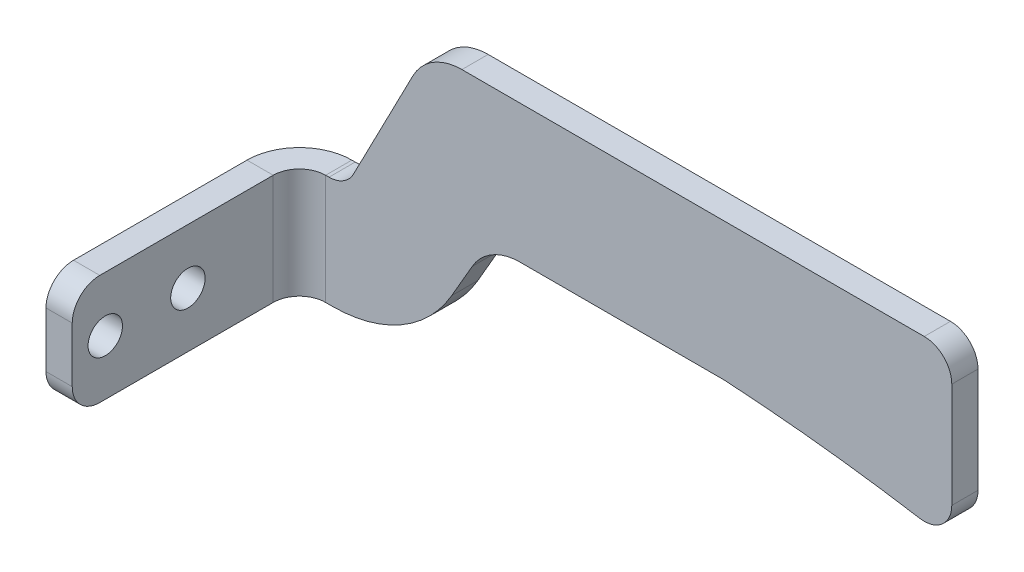
ISO-10303-21;
HEADER;
FILE_DESCRIPTION(('STEP AP214'),'2;1');
FILE_NAME('part.step','',(''),(''),'','','');
FILE_SCHEMA(('AUTOMOTIVE_DESIGN { 1 0 10303 214 1 1 1 1 }'));
ENDSEC;
DATA;
#1=APPLICATION_CONTEXT('core data for automotive mechanical design processes');
#2=APPLICATION_PROTOCOL_DEFINITION('international standard','automotive_design',2000,#1);
#3=PRODUCT_CONTEXT('',#1,'mechanical');
#4=PRODUCT('Part','Part','',(#3));
#5=PRODUCT_RELATED_PRODUCT_CATEGORY('part','',(#4));
#6=PRODUCT_DEFINITION_FORMATION('','',#4);
#7=PRODUCT_DEFINITION_CONTEXT('part definition',#1,'design');
#8=PRODUCT_DEFINITION('design','',#6,#7);
#9=PRODUCT_DEFINITION_SHAPE('','',#8);
#10=(LENGTH_UNIT() NAMED_UNIT(*) SI_UNIT(.MILLI.,.METRE.));
#11=(NAMED_UNIT(*) PLANE_ANGLE_UNIT() SI_UNIT($,.RADIAN.));
#12=(NAMED_UNIT(*) SI_UNIT($,.STERADIAN.) SOLID_ANGLE_UNIT());
#13=UNCERTAINTY_MEASURE_WITH_UNIT(LENGTH_MEASURE(1.E-05),#10,'distance_accuracy_value','');
#14=(GEOMETRIC_REPRESENTATION_CONTEXT(3) GLOBAL_UNCERTAINTY_ASSIGNED_CONTEXT((#13)) GLOBAL_UNIT_ASSIGNED_CONTEXT((#10,
#11,#12)) REPRESENTATION_CONTEXT('',''));
#15=CARTESIAN_POINT('',(0.,0.,0.));
#16=DIRECTION('',(0.,0.,1.));
#17=DIRECTION('',(1.,0.,0.));
#18=AXIS2_PLACEMENT_3D('',#15,#16,#17);
#19=CARTESIAN_POINT('',(1.21624327025932,25.,6.35));
#20=DIRECTION('',(0.,0.,1.));
#21=DIRECTION('',(1.,0.,0.));
#22=AXIS2_PLACEMENT_3D('',#19,#20,#21);
#23=CYLINDRICAL_SURFACE('',#22,25.);
#24=DIRECTION('',(0.,0.,1.));
#25=VECTOR('',#24,1.);
#26=CARTESIAN_POINT('',(1.21624327025932,0.,6.35));
#27=LINE('',#26,#25);
#28=CARTESIAN_POINT('',(1.21624327025927,0.,1.59));
#29=VERTEX_POINT('',#28);
#30=CARTESIAN_POINT('',(1.21624327025932,0.,6.35));
#31=VERTEX_POINT('',#30);
#32=EDGE_CURVE('E378',#29,#31,#27,.T.);
#33=ORIENTED_EDGE('',*,*,#32,.F.);
#34=CARTESIAN_POINT('',(1.21624327025932,25.,1.59));
#35=DIRECTION('',(0.,0.,1.));
#36=DIRECTION('',(1.,0.,0.));
#37=AXIS2_PLACEMENT_3D('',#34,#35,#36);
#38=CIRCLE('',#37,25.);
#39=CARTESIAN_POINT('',(22.8668783648703,12.5,1.59));
#40=VERTEX_POINT('',#39);
#41=EDGE_CURVE('E347',#29,#40,#38,.T.);
#42=ORIENTED_EDGE('',*,*,#41,.T.);
#43=DIRECTION('',(0.,0.,1.));
#44=VECTOR('',#43,1.);
#45=CARTESIAN_POINT('',(22.8668783648703,12.5000000000001,6.35));
#46=LINE('',#45,#44);
#47=CARTESIAN_POINT('',(22.8668783648703,12.5000000000001,6.35));
#48=VERTEX_POINT('',#47);
#49=EDGE_CURVE('E376',#40,#48,#46,.T.);
#50=ORIENTED_EDGE('',*,*,#49,.T.);
#51=CARTESIAN_POINT('',(1.21624327025932,25.,6.35));
#52=DIRECTION('',(0.,0.,1.));
#53=DIRECTION('',(1.,0.,0.));
#54=AXIS2_PLACEMENT_3D('',#51,#52,#53);
#55=CIRCLE('',#54,25.);
#56=EDGE_CURVE('E270',#31,#48,#55,.T.);
#57=ORIENTED_EDGE('',*,*,#56,.F.);
#58=EDGE_LOOP('',(#33,#42,#50,#57));
#59=FACE_BOUND('',#58,.T.);
#60=ADVANCED_FACE('F74',(#59),#23,.T.);
#61=CARTESIAN_POINT('',(22.8668783648703,12.5000000000001,6.35));
#62=DIRECTION('',(0.86602540378444,-0.499999999999998,0.));
#63=DIRECTION('',(0.499999999999998,0.86602540378444,0.));
#64=AXIS2_PLACEMENT_3D('',#61,#62,#63);
#65=PLANE('',#64);
#66=ORIENTED_EDGE('',*,*,#49,.F.);
#67=DIRECTION('',(0.499999999999998,0.86602540378444,0.));
#68=VECTOR('',#67,1.);
#69=CARTESIAN_POINT('',(22.8668783648703,12.5000000000001,1.59));
#70=LINE('',#69,#68);
#71=CARTESIAN_POINT('',(26.6085481156726,18.9807621135333,1.59));
#72=VERTEX_POINT('',#71);
#73=EDGE_CURVE('E344',#40,#72,#70,.T.);
#74=ORIENTED_EDGE('',*,*,#73,.T.);
#75=DIRECTION('',(0.,0.,1.));
#76=VECTOR('',#75,1.);
#77=CARTESIAN_POINT('',(26.6085481156726,18.9807621135333,6.35));
#78=LINE('',#77,#76);
#79=CARTESIAN_POINT('',(26.6085481156726,18.9807621135333,6.35));
#80=VERTEX_POINT('',#79);
#81=EDGE_CURVE('E374',#72,#80,#78,.T.);
#82=ORIENTED_EDGE('',*,*,#81,.T.);
#83=DIRECTION('',(0.499999999999998,0.86602540378444,0.));
#84=VECTOR('',#83,1.);
#85=CARTESIAN_POINT('',(22.8668783648703,12.5000000000001,6.35));
#86=LINE('',#85,#84);
#87=EDGE_CURVE('E273',#48,#80,#86,.T.);
#88=ORIENTED_EDGE('',*,*,#87,.F.);
#89=EDGE_LOOP('',(#66,#74,#82,#88));
#90=FACE_BOUND('',#89,.T.);
#91=ADVANCED_FACE('F447',(#90),#65,.T.);
#92=CARTESIAN_POINT('',(35.2688021535169,13.9807621135333,6.35));
#93=DIRECTION('',(0.,0.,1.));
#94=DIRECTION('',(1.,0.,0.));
#95=AXIS2_PLACEMENT_3D('',#92,#93,#94);
#96=CYLINDRICAL_SURFACE('',#95,10.);
#97=ORIENTED_EDGE('',*,*,#81,.F.);
#98=CARTESIAN_POINT('',(35.268802153517,13.9807621135333,1.59));
#99=DIRECTION('',(0.,0.,-1.));
#100=DIRECTION('',(-1.,0.,0.));
#101=AXIS2_PLACEMENT_3D('',#98,#99,#100);
#102=CIRCLE('',#101,10.);
#103=CARTESIAN_POINT('',(35.268802153517,23.9807621135333,1.59));
#104=VERTEX_POINT('',#103);
#105=EDGE_CURVE('E341',#72,#104,#102,.T.);
#106=ORIENTED_EDGE('',*,*,#105,.T.);
#107=DIRECTION('',(0.,0.,1.));
#108=VECTOR('',#107,1.);
#109=CARTESIAN_POINT('',(35.268802153517,23.9807621135333,6.35));
#110=LINE('',#109,#108);
#111=CARTESIAN_POINT('',(35.268802153517,23.9807621135333,6.35));
#112=VERTEX_POINT('',#111);
#113=EDGE_CURVE('E372',#104,#112,#110,.T.);
#114=ORIENTED_EDGE('',*,*,#113,.T.);
#115=CARTESIAN_POINT('',(35.2688021535169,13.9807621135333,6.35));
#116=DIRECTION('',(0.,0.,-1.));
#117=DIRECTION('',(1.,0.,0.));
#118=AXIS2_PLACEMENT_3D('',#115,#116,#117);
#119=CIRCLE('',#118,10.);
#120=EDGE_CURVE('E276',#80,#112,#119,.T.);
#121=ORIENTED_EDGE('',*,*,#120,.F.);
#122=EDGE_LOOP('',(#97,#106,#114,#121));
#123=FACE_BOUND('',#122,.T.);
#124=ADVANCED_FACE('F453',(#123),#96,.F.);
#125=CARTESIAN_POINT('',(35.268802153517,23.9807621135333,6.35));
#126=DIRECTION('',(0.,-1.,0.));
#127=DIRECTION('',(1.,0.,0.));
#128=AXIS2_PLACEMENT_3D('',#125,#126,#127);
#129=PLANE('',#128);
#130=ORIENTED_EDGE('',*,*,#113,.F.);
#131=DIRECTION('',(1.,0.,0.));
#132=VECTOR('',#131,1.);
#133=CARTESIAN_POINT('',(0.60788379679623,23.9807621135333,1.59));
#134=LINE('',#133,#132);
#135=CARTESIAN_POINT('',(72.4353250304522,23.9807621135333,1.59));
#136=VERTEX_POINT('',#135);
#137=EDGE_CURVE('E338',#104,#136,#134,.T.);
#138=ORIENTED_EDGE('',*,*,#137,.T.);
#139=DIRECTION('',(0.,0.,1.));
#140=VECTOR('',#139,1.);
#141=CARTESIAN_POINT('',(72.4353250304512,23.9807621135333,6.35));
#142=LINE('',#141,#140);
#143=CARTESIAN_POINT('',(72.4353250304512,23.9807621135333,6.35));
#144=VERTEX_POINT('',#143);
#145=EDGE_CURVE('E370',#136,#144,#142,.T.);
#146=ORIENTED_EDGE('',*,*,#145,.T.);
#147=DIRECTION('',(1.,0.,0.));
#148=VECTOR('',#147,1.);
#149=CARTESIAN_POINT('',(35.268802153517,23.9807621135333,6.35));
#150=LINE('',#149,#148);
#151=EDGE_CURVE('E279',#112,#144,#150,.T.);
#152=ORIENTED_EDGE('',*,*,#151,.F.);
#153=EDGE_LOOP('',(#130,#138,#146,#152));
#154=FACE_BOUND('',#153,.T.);
#155=ADVANCED_FACE('F527',(#154),#129,.T.);
#156=CARTESIAN_POINT('',(50.9653122460359,-325.360100871369,6.35));
#157=DIRECTION('',(0.,0.,1.));
#158=DIRECTION('',(1.,0.,0.));
#159=AXIS2_PLACEMENT_3D('',#156,#157,#158);
#160=CYLINDRICAL_SURFACE('',#159,350.);
#161=ORIENTED_EDGE('',*,*,#145,.F.);
#162=CARTESIAN_POINT('',(50.9653122460359,-325.36010087137,1.59));
#163=DIRECTION('',(0.,0.,-1.));
#164=DIRECTION('',(-1.,0.,0.));
#165=AXIS2_PLACEMENT_3D('',#162,#163,#164);
#166=CIRCLE('',#165,350.);
#167=CARTESIAN_POINT('',(107.837539609099,19.9883459975337,1.59));
#168=VERTEX_POINT('',#167);
#169=EDGE_CURVE('E335',#136,#168,#166,.T.);
#170=ORIENTED_EDGE('',*,*,#169,.T.);
#171=DIRECTION('',(0.,0.,1.));
#172=VECTOR('',#171,1.);
#173=CARTESIAN_POINT('',(107.837539609099,19.9883459975337,6.35));
#174=LINE('',#173,#172);
#175=CARTESIAN_POINT('',(107.837539609099,19.9883459975337,6.35));
#176=VERTEX_POINT('',#175);
#177=EDGE_CURVE('E368',#168,#176,#174,.T.);
#178=ORIENTED_EDGE('',*,*,#177,.T.);
#179=CARTESIAN_POINT('',(50.9653122460359,-325.360100871369,6.35));
#180=DIRECTION('',(0.,0.,-1.));
#181=DIRECTION('',(1.,0.,0.));
#182=AXIS2_PLACEMENT_3D('',#179,#180,#181);
#183=CIRCLE('',#182,350.);
#184=EDGE_CURVE('E282',#144,#176,#183,.T.);
#185=ORIENTED_EDGE('',*,*,#184,.F.);
#186=EDGE_LOOP('',(#161,#170,#178,#185));
#187=FACE_BOUND('',#186,.T.);
#188=ADVANCED_FACE('F523',(#187),#160,.F.);
#189=CARTESIAN_POINT('',(108.65,24.9218952385181,6.35));
#190=DIRECTION('',(0.,0.,1.));
#191=DIRECTION('',(1.,0.,0.));
#192=AXIS2_PLACEMENT_3D('',#189,#190,#191);
#193=CYLINDRICAL_SURFACE('',#192,5.);
#194=ORIENTED_EDGE('',*,*,#177,.F.);
#195=CARTESIAN_POINT('',(108.65,24.9218952385181,1.59000000000001));
#196=DIRECTION('',(0.,0.,1.));
#197=DIRECTION('',(1.,0.,0.));
#198=AXIS2_PLACEMENT_3D('',#195,#196,#197);
#199=CIRCLE('',#198,5.);
#200=CARTESIAN_POINT('',(113.65,24.9218952385181,1.59000000000001));
#201=VERTEX_POINT('',#200);
#202=EDGE_CURVE('E332',#168,#201,#199,.T.);
#203=ORIENTED_EDGE('',*,*,#202,.T.);
#204=DIRECTION('',(0.,0.,1.));
#205=VECTOR('',#204,1.);
#206=CARTESIAN_POINT('',(113.65,24.9218952385181,6.35));
#207=LINE('',#206,#205);
#208=CARTESIAN_POINT('',(113.65,24.9218952385181,6.35));
#209=VERTEX_POINT('',#208);
#210=EDGE_CURVE('E366',#201,#209,#207,.T.);
#211=ORIENTED_EDGE('',*,*,#210,.T.);
#212=CARTESIAN_POINT('',(108.65,24.9218952385181,6.35));
#213=DIRECTION('',(0.,0.,1.));
#214=DIRECTION('',(1.,0.,0.));
#215=AXIS2_PLACEMENT_3D('',#212,#213,#214);
#216=CIRCLE('',#215,5.);
#217=EDGE_CURVE('E285',#176,#209,#216,.T.);
#218=ORIENTED_EDGE('',*,*,#217,.F.);
#219=EDGE_LOOP('',(#194,#203,#211,#218));
#220=FACE_BOUND('',#219,.T.);
#221=ADVANCED_FACE('F519',(#220),#193,.T.);
#222=CARTESIAN_POINT('',(113.65,24.9218952385181,6.35));
#223=DIRECTION('',(1.,0.,0.));
#224=DIRECTION('',(0.,1.,0.));
#225=AXIS2_PLACEMENT_3D('',#222,#223,#224);
#226=PLANE('',#225);
#227=ORIENTED_EDGE('',*,*,#210,.F.);
#228=DIRECTION('',(0.,1.,0.));
#229=VECTOR('',#228,1.);
#230=CARTESIAN_POINT('',(113.65,25.,1.59000000000001));
#231=LINE('',#230,#229);
#232=CARTESIAN_POINT('',(113.65,43.9807621135333,1.59));
#233=VERTEX_POINT('',#232);
#234=EDGE_CURVE('E329',#201,#233,#231,.T.);
#235=ORIENTED_EDGE('',*,*,#234,.T.);
#236=DIRECTION('',(0.,0.,1.));
#237=VECTOR('',#236,1.);
#238=CARTESIAN_POINT('',(113.65,43.9807621135333,6.35));
#239=LINE('',#238,#237);
#240=CARTESIAN_POINT('',(113.65,43.9807621135333,6.35));
#241=VERTEX_POINT('',#240);
#242=EDGE_CURVE('E364',#233,#241,#239,.T.);
#243=ORIENTED_EDGE('',*,*,#242,.T.);
#244=DIRECTION('',(0.,1.,0.));
#245=VECTOR('',#244,1.);
#246=CARTESIAN_POINT('',(113.65,24.9218952385181,6.35));
#247=LINE('',#246,#245);
#248=EDGE_CURVE('E288',#209,#241,#247,.T.);
#249=ORIENTED_EDGE('',*,*,#248,.F.);
#250=EDGE_LOOP('',(#227,#235,#243,#249));
#251=FACE_BOUND('',#250,.T.);
#252=ADVANCED_FACE('F515',(#251),#226,.T.);
#253=CARTESIAN_POINT('',(108.65,43.9807621135333,6.35));
#254=DIRECTION('',(0.,0.,1.));
#255=DIRECTION('',(1.,0.,0.));
#256=AXIS2_PLACEMENT_3D('',#253,#254,#255);
#257=CYLINDRICAL_SURFACE('',#256,5.);
#258=ORIENTED_EDGE('',*,*,#242,.F.);
#259=CARTESIAN_POINT('',(108.65,43.9807621135333,1.59000000000001));
#260=DIRECTION('',(0.,0.,1.));
#261=DIRECTION('',(1.,0.,0.));
#262=AXIS2_PLACEMENT_3D('',#259,#260,#261);
#263=CIRCLE('',#262,5.);
#264=CARTESIAN_POINT('',(108.65,48.9807621135333,1.59));
#265=VERTEX_POINT('',#264);
#266=EDGE_CURVE('E326',#233,#265,#263,.T.);
#267=ORIENTED_EDGE('',*,*,#266,.T.);
#268=DIRECTION('',(0.,0.,1.));
#269=VECTOR('',#268,1.);
#270=CARTESIAN_POINT('',(108.65,48.9807621135333,6.35));
#271=LINE('',#270,#269);
#272=CARTESIAN_POINT('',(108.65,48.9807621135333,6.35));
#273=VERTEX_POINT('',#272);
#274=EDGE_CURVE('E362',#265,#273,#271,.T.);
#275=ORIENTED_EDGE('',*,*,#274,.T.);
#276=CARTESIAN_POINT('',(108.65,43.9807621135333,6.35));
#277=DIRECTION('',(0.,0.,1.));
#278=DIRECTION('',(1.,0.,0.));
#279=AXIS2_PLACEMENT_3D('',#276,#277,#278);
#280=CIRCLE('',#279,5.);
#281=EDGE_CURVE('E291',#241,#273,#280,.T.);
#282=ORIENTED_EDGE('',*,*,#281,.F.);
#283=EDGE_LOOP('',(#258,#267,#275,#282));
#284=FACE_BOUND('',#283,.T.);
#285=ADVANCED_FACE('F511',(#284),#257,.T.);
#286=CARTESIAN_POINT('',(24.7342324064076,48.9807621135333,6.35));
#287=DIRECTION('',(0.,1.,0.));
#288=DIRECTION('',(-1.,0.,0.));
#289=AXIS2_PLACEMENT_3D('',#286,#287,#288);
#290=PLANE('',#289);
#291=ORIENTED_EDGE('',*,*,#274,.F.);
#292=DIRECTION('',(1.,0.,0.));
#293=VECTOR('',#292,1.);
#294=CARTESIAN_POINT('',(0.607883796796188,48.9807621135333,1.59));
#295=LINE('',#294,#293);
#296=CARTESIAN_POINT('',(24.7342324064075,48.9807621135333,1.59));
#297=VERTEX_POINT('',#296);
#298=EDGE_CURVE('E323',#265,#297,#295,.F.);
#299=ORIENTED_EDGE('',*,*,#298,.T.);
#300=DIRECTION('',(0.,0.,1.));
#301=VECTOR('',#300,1.);
#302=CARTESIAN_POINT('',(24.7342324064076,48.9807621135333,6.35));
#303=LINE('',#302,#301);
#304=CARTESIAN_POINT('',(24.7342324064076,48.9807621135333,6.35));
#305=VERTEX_POINT('',#304);
#306=EDGE_CURVE('E360',#297,#305,#303,.T.);
#307=ORIENTED_EDGE('',*,*,#306,.T.);
#308=DIRECTION('',(-1.,0.,0.));
#309=VECTOR('',#308,1.);
#310=CARTESIAN_POINT('',(24.7342324064076,48.9807621135333,6.35));
#311=LINE('',#310,#309);
#312=EDGE_CURVE('E294',#273,#305,#311,.T.);
#313=ORIENTED_EDGE('',*,*,#312,.F.);
#314=EDGE_LOOP('',(#291,#299,#307,#313));
#315=FACE_BOUND('',#314,.T.);
#316=ADVANCED_FACE('F507',(#315),#290,.T.);
#317=CARTESIAN_POINT('',(24.7342324064076,38.9807621135333,6.35));
#318=DIRECTION('',(0.,0.,1.));
#319=DIRECTION('',(1.,0.,0.));
#320=AXIS2_PLACEMENT_3D('',#317,#318,#319);
#321=CYLINDRICAL_SURFACE('',#320,10.);
#322=ORIENTED_EDGE('',*,*,#306,.F.);
#323=CARTESIAN_POINT('',(24.7342324064075,38.9807621135333,1.59000000000001));
#324=DIRECTION('',(0.,0.,1.));
#325=DIRECTION('',(1.,0.,0.));
#326=AXIS2_PLACEMENT_3D('',#323,#324,#325);
#327=CIRCLE('',#326,10.);
#328=CARTESIAN_POINT('',(15.853300618686,43.5773968153383,1.59));
#329=VERTEX_POINT('',#328);
#330=EDGE_CURVE('E320',#297,#329,#327,.T.);
#331=ORIENTED_EDGE('',*,*,#330,.T.);
#332=DIRECTION('',(0.,0.,1.));
#333=VECTOR('',#332,1.);
#334=CARTESIAN_POINT('',(15.853300618686,43.5773968153383,6.35));
#335=LINE('',#334,#333);
#336=CARTESIAN_POINT('',(15.853300618686,43.5773968153383,6.35));
#337=VERTEX_POINT('',#336);
#338=EDGE_CURVE('E358',#329,#337,#335,.T.);
#339=ORIENTED_EDGE('',*,*,#338,.T.);
#340=CARTESIAN_POINT('',(24.7342324064076,38.9807621135333,6.35));
#341=DIRECTION('',(0.,0.,1.));
#342=DIRECTION('',(1.,0.,0.));
#343=AXIS2_PLACEMENT_3D('',#340,#341,#342);
#344=CIRCLE('',#343,10.);
#345=EDGE_CURVE('E297',#305,#337,#344,.T.);
#346=ORIENTED_EDGE('',*,*,#345,.F.);
#347=EDGE_LOOP('',(#322,#331,#339,#346));
#348=FACE_BOUND('',#347,.T.);
#349=ADVANCED_FACE('F503',(#348),#321,.T.);
#350=CARTESIAN_POINT('',(5.04834969065698,22.7016826490975,6.35));
#351=DIRECTION('',(-0.88809317877215,0.459663470180499,0.));
#352=DIRECTION('',(-0.459663470180498,-0.88809317877215,0.));
#353=AXIS2_PLACEMENT_3D('',#350,#351,#352);
#354=PLANE('',#353);
#355=ORIENTED_EDGE('',*,*,#338,.F.);
#356=DIRECTION('',(-0.459663470180498,-0.88809317877215,0.));
#357=VECTOR('',#356,1.);
#358=CARTESIAN_POINT('',(5.04834969065697,22.7016826490975,1.59));
#359=LINE('',#358,#357);
#360=CARTESIAN_POINT('',(5.04834969065697,22.7016826490975,1.59));
#361=VERTEX_POINT('',#360);
#362=EDGE_CURVE('E317',#329,#361,#359,.T.);
#363=ORIENTED_EDGE('',*,*,#362,.T.);
#364=DIRECTION('',(0.,0.,1.));
#365=VECTOR('',#364,1.);
#366=CARTESIAN_POINT('',(5.04834969065698,22.7016826490975,6.35));
#367=LINE('',#366,#365);
#368=CARTESIAN_POINT('',(5.04834969065698,22.7016826490975,6.35));
#369=VERTEX_POINT('',#368);
#370=EDGE_CURVE('E356',#361,#369,#367,.T.);
#371=ORIENTED_EDGE('',*,*,#370,.T.);
#372=DIRECTION('',(-0.459663470180498,-0.88809317877215,0.));
#373=VECTOR('',#372,1.);
#374=CARTESIAN_POINT('',(5.04834969065698,22.7016826490975,6.35));
#375=LINE('',#374,#373);
#376=EDGE_CURVE('E300',#337,#369,#375,.T.);
#377=ORIENTED_EDGE('',*,*,#376,.F.);
#378=EDGE_LOOP('',(#355,#363,#371,#377));
#379=FACE_BOUND('',#378,.T.);
#380=ADVANCED_FACE('F499',(#379),#354,.T.);
#381=CARTESIAN_POINT('',(0.607883796796244,25.,6.35));
#382=DIRECTION('',(0.,0.,1.));
#383=DIRECTION('',(1.,0.,0.));
#384=AXIS2_PLACEMENT_3D('',#381,#382,#383);
#385=CYLINDRICAL_SURFACE('',#384,5.);
#386=ORIENTED_EDGE('',*,*,#370,.F.);
#387=CARTESIAN_POINT('',(0.60788379679623,25.,1.59));
#388=DIRECTION('',(0.,0.,-1.));
#389=DIRECTION('',(-1.,0.,0.));
#390=AXIS2_PLACEMENT_3D('',#387,#388,#389);
#391=CIRCLE('',#390,5.);
#392=CARTESIAN_POINT('',(0.60788379679623,20.,1.59));
#393=VERTEX_POINT('',#392);
#394=EDGE_CURVE('E314',#361,#393,#391,.T.);
#395=ORIENTED_EDGE('',*,*,#394,.T.);
#396=DIRECTION('',(0.,0.,1.));
#397=VECTOR('',#396,1.);
#398=CARTESIAN_POINT('',(0.60788379679623,20.,6.35));
#399=LINE('',#398,#397);
#400=CARTESIAN_POINT('',(0.60788379679623,20.,6.35));
#401=VERTEX_POINT('',#400);
#402=EDGE_CURVE('E354',#393,#401,#399,.T.);
#403=ORIENTED_EDGE('',*,*,#402,.T.);
#404=CARTESIAN_POINT('',(0.607883796796244,25.,6.35));
#405=DIRECTION('',(0.,0.,-1.));
#406=DIRECTION('',(1.,0.,0.));
#407=AXIS2_PLACEMENT_3D('',#404,#405,#406);
#408=CIRCLE('',#407,5.);
#409=EDGE_CURVE('E303',#369,#401,#408,.T.);
#410=ORIENTED_EDGE('',*,*,#409,.F.);
#411=EDGE_LOOP('',(#386,#395,#403,#410));
#412=FACE_BOUND('',#411,.T.);
#413=ADVANCED_FACE('F495',(#412),#385,.F.);
#414=CARTESIAN_POINT('',(0.60788379679623,20.,6.35));
#415=DIRECTION('',(0.,1.,0.));
#416=DIRECTION('',(-1.,0.,0.));
#417=AXIS2_PLACEMENT_3D('',#414,#415,#416);
#418=PLANE('',#417);
#419=ORIENTED_EDGE('',*,*,#402,.F.);
#420=DIRECTION('',(1.,0.,0.));
#421=VECTOR('',#420,1.);
#422=CARTESIAN_POINT('',(0.60788379679623,20.,1.59));
#423=LINE('',#422,#421);
#424=CARTESIAN_POINT('',(0.,20.,1.59));
#425=VERTEX_POINT('',#424);
#426=EDGE_CURVE('E267',#393,#425,#423,.F.);
#427=ORIENTED_EDGE('',*,*,#426,.T.);
#428=DIRECTION('',(0.,0.,1.));
#429=VECTOR('',#428,1.);
#430=CARTESIAN_POINT('',(0.,20.,6.35));
#431=LINE('',#430,#429);
#432=CARTESIAN_POINT('',(0.,20.,6.35));
#433=VERTEX_POINT('',#432);
#434=EDGE_CURVE('E352',#425,#433,#431,.T.);
#435=ORIENTED_EDGE('',*,*,#434,.T.);
#436=DIRECTION('',(-1.,0.,0.));
#437=VECTOR('',#436,1.);
#438=CARTESIAN_POINT('',(0.60788379679623,20.,6.35));
#439=LINE('',#438,#437);
#440=EDGE_CURVE('E306',#401,#433,#439,.T.);
#441=ORIENTED_EDGE('',*,*,#440,.F.);
#442=EDGE_LOOP('',(#419,#427,#435,#441));
#443=FACE_BOUND('',#442,.T.);
#444=ADVANCED_FACE('F461',(#443),#418,.T.);
#445=CARTESIAN_POINT('',(0.,0.,6.35));
#446=DIRECTION('',(0.,-1.,0.));
#447=DIRECTION('',(1.,0.,0.));
#448=AXIS2_PLACEMENT_3D('',#445,#446,#447);
#449=PLANE('',#448);
#450=DIRECTION('',(1.,0.,0.));
#451=VECTOR('',#450,1.);
#452=CARTESIAN_POINT('',(0.607883796796188,0.,1.59));
#453=LINE('',#452,#451);
#454=CARTESIAN_POINT('',(0.,0.,1.59));
#455=VERTEX_POINT('',#454);
#456=EDGE_CURVE('E311',#455,#29,#453,.T.);
#457=ORIENTED_EDGE('',*,*,#456,.T.);
#458=ORIENTED_EDGE('',*,*,#32,.T.);
#459=DIRECTION('',(1.,0.,0.));
#460=VECTOR('',#459,1.);
#461=CARTESIAN_POINT('',(0.,0.,6.35));
#462=LINE('',#461,#460);
#463=CARTESIAN_POINT('',(0.,0.,6.35));
#464=VERTEX_POINT('',#463);
#465=EDGE_CURVE('E266',#464,#31,#462,.T.);
#466=ORIENTED_EDGE('',*,*,#465,.F.);
#467=DIRECTION('',(0.,0.,1.));
#468=VECTOR('',#467,1.);
#469=CARTESIAN_POINT('',(0.,0.,6.35));
#470=LINE('',#469,#468);
#471=EDGE_CURVE('E309',#455,#464,#470,.T.);
#472=ORIENTED_EDGE('',*,*,#471,.F.);
#473=EDGE_LOOP('',(#457,#458,#466,#472));
#474=FACE_BOUND('',#473,.T.);
#475=ADVANCED_FACE('F458',(#474),#449,.T.);
#476=CARTESIAN_POINT('',(0.607883796796244,25.,6.35));
#477=DIRECTION('',(0.,0.,1.));
#478=DIRECTION('',(1.,0.,0.));
#479=AXIS2_PLACEMENT_3D('',#476,#477,#478);
#480=PLANE('',#479);
#481=DIRECTION('',(0.,-1.,0.));
#482=VECTOR('',#481,1.);
#483=CARTESIAN_POINT('',(0.,0.,6.35));
#484=LINE('',#483,#482);
#485=EDGE_CURVE('E264',#433,#464,#484,.T.);
#486=ORIENTED_EDGE('',*,*,#485,.T.);
#487=ORIENTED_EDGE('',*,*,#465,.T.);
#488=ORIENTED_EDGE('',*,*,#56,.T.);
#489=ORIENTED_EDGE('',*,*,#87,.T.);
#490=ORIENTED_EDGE('',*,*,#120,.T.);
#491=ORIENTED_EDGE('',*,*,#151,.T.);
#492=ORIENTED_EDGE('',*,*,#184,.T.);
#493=ORIENTED_EDGE('',*,*,#217,.T.);
#494=ORIENTED_EDGE('',*,*,#248,.T.);
#495=ORIENTED_EDGE('',*,*,#281,.T.);
#496=ORIENTED_EDGE('',*,*,#312,.T.);
#497=ORIENTED_EDGE('',*,*,#345,.T.);
#498=ORIENTED_EDGE('',*,*,#376,.T.);
#499=ORIENTED_EDGE('',*,*,#409,.T.);
#500=ORIENTED_EDGE('',*,*,#440,.T.);
#501=EDGE_LOOP('',(#486,#487,#488,#489,#490,#491,#492,#493,#494,#495,#496,#497,#498,#499,#500));
#502=FACE_BOUND('',#501,.T.);
#503=ADVANCED_FACE('F460',(#502),#480,.T.);
#504=CARTESIAN_POINT('',(0.60788379679623,25.,1.59));
#505=DIRECTION('',(0.,0.,1.));
#506=DIRECTION('',(1.,0.,0.));
#507=AXIS2_PLACEMENT_3D('',#504,#505,#506);
#508=PLANE('',#507);
#509=DIRECTION('',(0.,1.,0.));
#510=VECTOR('',#509,1.);
#511=CARTESIAN_POINT('',(0.,25.,1.59000000000001));
#512=LINE('',#511,#510);
#513=EDGE_CURVE('E232',#425,#455,#512,.F.);
#514=ORIENTED_EDGE('',*,*,#513,.F.);
#515=ORIENTED_EDGE('',*,*,#426,.F.);
#516=ORIENTED_EDGE('',*,*,#394,.F.);
#517=ORIENTED_EDGE('',*,*,#362,.F.);
#518=ORIENTED_EDGE('',*,*,#330,.F.);
#519=ORIENTED_EDGE('',*,*,#298,.F.);
#520=ORIENTED_EDGE('',*,*,#266,.F.);
#521=ORIENTED_EDGE('',*,*,#234,.F.);
#522=ORIENTED_EDGE('',*,*,#202,.F.);
#523=ORIENTED_EDGE('',*,*,#169,.F.);
#524=ORIENTED_EDGE('',*,*,#137,.F.);
#525=ORIENTED_EDGE('',*,*,#105,.F.);
#526=ORIENTED_EDGE('',*,*,#73,.F.);
#527=ORIENTED_EDGE('',*,*,#41,.F.);
#528=ORIENTED_EDGE('',*,*,#456,.F.);
#529=EDGE_LOOP('',(#514,#515,#516,#517,#518,#519,#520,#521,#522,#523,#524,#525,#526,#527,#528));
#530=FACE_BOUND('',#529,.T.);
#531=ADVANCED_FACE('F483',(#530),#508,.F.);
#532=CARTESIAN_POINT('',(0.,20.,11.11));
#533=DIRECTION('',(0.,1.,0.));
#534=DIRECTION('',(-1.,0.,0.));
#535=AXIS2_PLACEMENT_3D('',#532,#533,#534);
#536=PLANE('',#535);
#537=DIRECTION('',(-1.,0.,0.));
#538=VECTOR('',#537,1.);
#539=CARTESIAN_POINT('',(-9.52,20.,11.11));
#540=LINE('',#539,#538);
#541=CARTESIAN_POINT('',(-4.76,20.,11.11));
#542=VERTEX_POINT('',#541);
#543=CARTESIAN_POINT('',(-9.52,20.,11.11));
#544=VERTEX_POINT('',#543);
#545=EDGE_CURVE('E256',#542,#544,#540,.T.);
#546=ORIENTED_EDGE('',*,*,#545,.F.);
#547=CARTESIAN_POINT('',(0.,20.,11.11));
#548=DIRECTION('',(0.,-1.,0.));
#549=DIRECTION('',(1.,0.,0.));
#550=AXIS2_PLACEMENT_3D('',#547,#548,#549);
#551=CIRCLE('',#550,4.76);
#552=EDGE_CURVE('E236',#433,#542,#551,.F.);
#553=ORIENTED_EDGE('',*,*,#552,.F.);
#554=ORIENTED_EDGE('',*,*,#434,.F.);
#555=CARTESIAN_POINT('',(0.,20.,11.11));
#556=DIRECTION('',(0.,-1.,0.));
#557=DIRECTION('',(1.,0.,0.));
#558=AXIS2_PLACEMENT_3D('',#555,#556,#557);
#559=CIRCLE('',#558,9.52);
#560=EDGE_CURVE('E235',#425,#544,#559,.F.);
#561=ORIENTED_EDGE('',*,*,#560,.T.);
#562=EDGE_LOOP('',(#546,#553,#554,#561));
#563=FACE_BOUND('',#562,.T.);
#564=ADVANCED_FACE('F480',(#563),#536,.T.);
#565=CARTESIAN_POINT('',(0.,0.,11.11));
#566=DIRECTION('',(0.,1.,0.));
#567=DIRECTION('',(-1.,0.,0.));
#568=AXIS2_PLACEMENT_3D('',#565,#566,#567);
#569=PLANE('',#568);
#570=CARTESIAN_POINT('',(0.,0.,11.11));
#571=DIRECTION('',(0.,-1.,0.));
#572=DIRECTION('',(1.,0.,0.));
#573=AXIS2_PLACEMENT_3D('',#570,#571,#572);
#574=CIRCLE('',#573,4.76);
#575=CARTESIAN_POINT('',(-4.76,0.,11.11));
#576=VERTEX_POINT('',#575);
#577=EDGE_CURVE('E221',#576,#464,#574,.T.);
#578=ORIENTED_EDGE('',*,*,#577,.F.);
#579=DIRECTION('',(-1.,0.,0.));
#580=VECTOR('',#579,1.);
#581=CARTESIAN_POINT('',(-4.76,0.,11.11));
#582=LINE('',#581,#580);
#583=CARTESIAN_POINT('',(-9.52,0.,11.11));
#584=VERTEX_POINT('',#583);
#585=EDGE_CURVE('E219',#576,#584,#582,.T.);
#586=ORIENTED_EDGE('',*,*,#585,.T.);
#587=CARTESIAN_POINT('',(0.,0.,11.11));
#588=DIRECTION('',(0.,-1.,0.));
#589=DIRECTION('',(1.,0.,0.));
#590=AXIS2_PLACEMENT_3D('',#587,#588,#589);
#591=CIRCLE('',#590,9.52);
#592=EDGE_CURVE('E227',#584,#455,#591,.T.);
#593=ORIENTED_EDGE('',*,*,#592,.T.);
#594=ORIENTED_EDGE('',*,*,#471,.T.);
#595=EDGE_LOOP('',(#578,#586,#593,#594));
#596=FACE_BOUND('',#595,.T.);
#597=ADVANCED_FACE('F239',(#596),#569,.F.);
#598=CARTESIAN_POINT('',(0.,0.,11.11));
#599=DIRECTION('',(0.,-1.,0.));
#600=DIRECTION('',(-1.,0.,0.));
#601=AXIS2_PLACEMENT_3D('',#598,#599,#600);
#602=CYLINDRICAL_SURFACE('',#601,9.52);
#603=ORIENTED_EDGE('',*,*,#513,.T.);
#604=ORIENTED_EDGE('',*,*,#592,.F.);
#605=DIRECTION('',(0.,-1.,0.));
#606=VECTOR('',#605,1.);
#607=CARTESIAN_POINT('',(-9.52,0.,11.11));
#608=LINE('',#607,#606);
#609=EDGE_CURVE('E230',#544,#584,#608,.T.);
#610=ORIENTED_EDGE('',*,*,#609,.F.);
#611=ORIENTED_EDGE('',*,*,#560,.F.);
#612=EDGE_LOOP('',(#603,#604,#610,#611));
#613=FACE_BOUND('',#612,.T.);
#614=ADVANCED_FACE('F228',(#613),#602,.T.);
#615=CARTESIAN_POINT('',(0.,0.,11.11));
#616=DIRECTION('',(0.,-1.,0.));
#617=DIRECTION('',(-1.,0.,0.));
#618=AXIS2_PLACEMENT_3D('',#615,#616,#617);
#619=CYLINDRICAL_SURFACE('',#618,4.76);
#620=ORIENTED_EDGE('',*,*,#485,.F.);
#621=ORIENTED_EDGE('',*,*,#552,.T.);
#622=DIRECTION('',(0.,1.,0.));
#623=VECTOR('',#622,1.);
#624=CARTESIAN_POINT('',(-4.76,20.,11.11));
#625=LINE('',#624,#623);
#626=EDGE_CURVE('E241',#542,#576,#625,.F.);
#627=ORIENTED_EDGE('',*,*,#626,.T.);
#628=ORIENTED_EDGE('',*,*,#577,.T.);
#629=EDGE_LOOP('',(#620,#621,#627,#628));
#630=FACE_BOUND('',#629,.T.);
#631=ADVANCED_FACE('F476',(#630),#619,.F.);
#632=CARTESIAN_POINT('',(-9.51999999999999,0.,6.34999999999999));
#633=DIRECTION('',(0.,-1.,0.));
#634=DIRECTION('',(1.,0.,0.));
#635=AXIS2_PLACEMENT_3D('',#632,#633,#634);
#636=PLANE('',#635);
#637=DIRECTION('',(0.,0.,1.));
#638=VECTOR('',#637,1.);
#639=CARTESIAN_POINT('',(-4.75999999999996,0.,0.));
#640=LINE('',#639,#638);
#641=CARTESIAN_POINT('',(-4.76000000000011,0.,42.59));
#642=VERTEX_POINT('',#641);
#643=EDGE_CURVE('E400',#642,#576,#640,.F.);
#644=ORIENTED_EDGE('',*,*,#643,.F.);
#645=DIRECTION('',(1.,0.,0.));
#646=VECTOR('',#645,1.);
#647=CARTESIAN_POINT('',(-9.52000000000011,0.,42.59));
#648=LINE('',#647,#646);
#649=CARTESIAN_POINT('',(-9.52000000000011,0.,42.59));
#650=VERTEX_POINT('',#649);
#651=EDGE_CURVE('E15',#642,#650,#648,.F.);
#652=ORIENTED_EDGE('',*,*,#651,.T.);
#653=DIRECTION('',(0.,0.,-1.));
#654=VECTOR('',#653,1.);
#655=CARTESIAN_POINT('',(-9.51999999999999,0.,6.34999999999999));
#656=LINE('',#655,#654);
#657=EDGE_CURVE('E215',#650,#584,#656,.T.);
#658=ORIENTED_EDGE('',*,*,#657,.T.);
#659=ORIENTED_EDGE('',*,*,#585,.F.);
#660=EDGE_LOOP('',(#644,#652,#658,#659));
#661=FACE_BOUND('',#660,.T.);
#662=ADVANCED_FACE('F217',(#661),#636,.T.);
#663=CARTESIAN_POINT('',(-9.52000000000014,20.,47.59));
#664=DIRECTION('',(0.,1.,0.));
#665=DIRECTION('',(-1.,0.,0.));
#666=AXIS2_PLACEMENT_3D('',#663,#664,#665);
#667=PLANE('',#666);
#668=DIRECTION('',(0.,0.,1.));
#669=VECTOR('',#668,1.);
#670=CARTESIAN_POINT('',(-9.52000000000014,20.,47.59));
#671=LINE('',#670,#669);
#672=CARTESIAN_POINT('',(-9.52000000000011,20.,42.59));
#673=VERTEX_POINT('',#672);
#674=EDGE_CURVE('E246',#544,#673,#671,.T.);
#675=ORIENTED_EDGE('',*,*,#674,.T.);
#676=DIRECTION('',(1.,0.,0.));
#677=VECTOR('',#676,1.);
#678=CARTESIAN_POINT('',(-9.52000000000011,20.,42.59));
#679=LINE('',#678,#677);
#680=CARTESIAN_POINT('',(-4.76000000000011,20.,42.59));
#681=VERTEX_POINT('',#680);
#682=EDGE_CURVE('E380',#673,#681,#679,.T.);
#683=ORIENTED_EDGE('',*,*,#682,.T.);
#684=DIRECTION('',(0.,0.,-1.));
#685=VECTOR('',#684,1.);
#686=CARTESIAN_POINT('',(-4.75999999999996,20.,0.));
#687=LINE('',#686,#685);
#688=EDGE_CURVE('E247',#542,#681,#687,.F.);
#689=ORIENTED_EDGE('',*,*,#688,.F.);
#690=ORIENTED_EDGE('',*,*,#545,.T.);
#691=EDGE_LOOP('',(#675,#683,#689,#690));
#692=FACE_BOUND('',#691,.T.);
#693=ADVANCED_FACE('F398',(#692),#667,.T.);
#694=CARTESIAN_POINT('',(-9.51999999999996,0.,0.));
#695=DIRECTION('',(-1.,0.,0.));
#696=DIRECTION('',(0.,0.,1.));
#697=AXIS2_PLACEMENT_3D('',#694,#695,#696);
#698=PLANE('',#697);
#699=CARTESIAN_POINT('',(-9.52000000000006,9.99999999999999,26.59));
#700=DIRECTION('',(-1.,0.,0.));
#701=DIRECTION('',(0.,0.,1.));
#702=AXIS2_PLACEMENT_3D('',#699,#700,#701);
#703=CIRCLE('',#702,3.125);
#704=CARTESIAN_POINT('',(-9.52000000000007,9.99999999999999,29.715));
#705=VERTEX_POINT('',#704);
#706=EDGE_CURVE('E420',#705,#705,#703,.F.);
#707=ORIENTED_EDGE('',*,*,#706,.T.);
#708=EDGE_LOOP('',(#707));
#709=FACE_BOUND('',#708,.T.);
#710=CARTESIAN_POINT('',(-9.52000000000011,9.99999999999999,41.59));
#711=DIRECTION('',(-1.,0.,0.));
#712=DIRECTION('',(0.,0.,1.));
#713=AXIS2_PLACEMENT_3D('',#710,#711,#712);
#714=CIRCLE('',#713,3.125);
#715=CARTESIAN_POINT('',(-9.52000000000012,9.99999999999999,44.715));
#716=VERTEX_POINT('',#715);
#717=EDGE_CURVE('E417',#716,#716,#714,.F.);
#718=ORIENTED_EDGE('',*,*,#717,.T.);
#719=EDGE_LOOP('',(#718));
#720=FACE_BOUND('',#719,.T.);
#721=DIRECTION('',(0.,-1.,0.));
#722=VECTOR('',#721,1.);
#723=CARTESIAN_POINT('',(-9.52000000000018,0.,47.59));
#724=LINE('',#723,#722);
#725=CARTESIAN_POINT('',(-9.52000000000015,15.,47.59));
#726=VERTEX_POINT('',#725);
#727=CARTESIAN_POINT('',(-9.52000000000018,4.99999999999999,47.59));
#728=VERTEX_POINT('',#727);
#729=EDGE_CURVE('E222',#726,#728,#724,.T.);
#730=ORIENTED_EDGE('',*,*,#729,.F.);
#731=CARTESIAN_POINT('',(-9.52000000000011,15.,42.59));
#732=DIRECTION('',(-1.,0.,0.));
#733=DIRECTION('',(0.,0.,1.));
#734=AXIS2_PLACEMENT_3D('',#731,#732,#733);
#735=CIRCLE('',#734,5.);
#736=EDGE_CURVE('E82',#726,#673,#735,.T.);
#737=ORIENTED_EDGE('',*,*,#736,.T.);
#738=ORIENTED_EDGE('',*,*,#674,.F.);
#739=ORIENTED_EDGE('',*,*,#609,.T.);
#740=ORIENTED_EDGE('',*,*,#657,.F.);
#741=CARTESIAN_POINT('',(-9.52000000000011,5.,42.59));
#742=DIRECTION('',(-1.,0.,0.));
#743=DIRECTION('',(0.,0.,1.));
#744=AXIS2_PLACEMENT_3D('',#741,#742,#743);
#745=CIRCLE('',#744,5.);
#746=EDGE_CURVE('E94',#650,#728,#745,.T.);
#747=ORIENTED_EDGE('',*,*,#746,.T.);
#748=EDGE_LOOP('',(#730,#737,#738,#739,#740,#747));
#749=FACE_BOUND('',#748,.T.);
#750=ADVANCED_FACE('F244',(#709,#720,#749),#698,.T.);
#751=CARTESIAN_POINT('',(-4.75999999999996,0.,0.));
#752=DIRECTION('',(-1.,0.,0.));
#753=DIRECTION('',(0.,0.,1.));
#754=AXIS2_PLACEMENT_3D('',#751,#752,#753);
#755=PLANE('',#754);
#756=CARTESIAN_POINT('',(-4.76000000000006,9.99999999999999,26.59));
#757=DIRECTION('',(1.,0.,0.));
#758=DIRECTION('',(0.,0.,-1.));
#759=AXIS2_PLACEMENT_3D('',#756,#757,#758);
#760=CIRCLE('',#759,3.125);
#761=CARTESIAN_POINT('',(-4.76000000000004,9.99999999999999,23.465));
#762=VERTEX_POINT('',#761);
#763=EDGE_CURVE('E259',#762,#762,#760,.T.);
#764=ORIENTED_EDGE('',*,*,#763,.F.);
#765=EDGE_LOOP('',(#764));
#766=FACE_BOUND('',#765,.T.);
#767=CARTESIAN_POINT('',(-4.76000000000011,10.,41.59));
#768=DIRECTION('',(1.,0.,0.));
#769=DIRECTION('',(0.,0.,-1.));
#770=AXIS2_PLACEMENT_3D('',#767,#768,#769);
#771=CIRCLE('',#770,3.125);
#772=CARTESIAN_POINT('',(-4.7600000000001,10.,38.465));
#773=VERTEX_POINT('',#772);
#774=EDGE_CURVE('E414',#773,#773,#771,.T.);
#775=ORIENTED_EDGE('',*,*,#774,.F.);
#776=EDGE_LOOP('',(#775));
#777=FACE_BOUND('',#776,.T.);
#778=ORIENTED_EDGE('',*,*,#688,.T.);
#779=CARTESIAN_POINT('',(-4.76000000000011,15.,42.59));
#780=DIRECTION('',(-1.,0.,0.));
#781=DIRECTION('',(0.,0.,1.));
#782=AXIS2_PLACEMENT_3D('',#779,#780,#781);
#783=CIRCLE('',#782,5.);
#784=CARTESIAN_POINT('',(-4.76000000000018,15.,47.59));
#785=VERTEX_POINT('',#784);
#786=EDGE_CURVE('E386',#681,#785,#783,.F.);
#787=ORIENTED_EDGE('',*,*,#786,.T.);
#788=DIRECTION('',(0.,1.,0.));
#789=VECTOR('',#788,1.);
#790=CARTESIAN_POINT('',(-4.76000000000018,0.,47.59));
#791=LINE('',#790,#789);
#792=CARTESIAN_POINT('',(-4.76000000000018,4.99999999999999,47.59));
#793=VERTEX_POINT('',#792);
#794=EDGE_CURVE('E250',#785,#793,#791,.F.);
#795=ORIENTED_EDGE('',*,*,#794,.T.);
#796=CARTESIAN_POINT('',(-4.76000000000011,5.,42.59));
#797=DIRECTION('',(-1.,0.,0.));
#798=DIRECTION('',(0.,0.,1.));
#799=AXIS2_PLACEMENT_3D('',#796,#797,#798);
#800=CIRCLE('',#799,5.);
#801=EDGE_CURVE('E384',#793,#642,#800,.F.);
#802=ORIENTED_EDGE('',*,*,#801,.T.);
#803=ORIENTED_EDGE('',*,*,#643,.T.);
#804=ORIENTED_EDGE('',*,*,#626,.F.);
#805=EDGE_LOOP('',(#778,#787,#795,#802,#803,#804));
#806=FACE_BOUND('',#805,.T.);
#807=ADVANCED_FACE('F406',(#766,#777,#806),#755,.F.);
#808=CARTESIAN_POINT('',(-9.52000000000018,0.,47.59));
#809=DIRECTION('',(0.,0.,1.));
#810=DIRECTION('',(1.,0.,0.));
#811=AXIS2_PLACEMENT_3D('',#808,#809,#810);
#812=PLANE('',#811);
#813=ORIENTED_EDGE('',*,*,#794,.F.);
#814=DIRECTION('',(1.,0.,0.));
#815=VECTOR('',#814,1.);
#816=CARTESIAN_POINT('',(-9.52000000000015,15.,47.59));
#817=LINE('',#816,#815);
#818=EDGE_CURVE('E391',#785,#726,#817,.F.);
#819=ORIENTED_EDGE('',*,*,#818,.T.);
#820=ORIENTED_EDGE('',*,*,#729,.T.);
#821=DIRECTION('',(1.,0.,0.));
#822=VECTOR('',#821,1.);
#823=CARTESIAN_POINT('',(-9.52000000000018,4.99999999999999,47.59));
#824=LINE('',#823,#822);
#825=EDGE_CURVE('E388',#728,#793,#824,.T.);
#826=ORIENTED_EDGE('',*,*,#825,.T.);
#827=EDGE_LOOP('',(#813,#819,#820,#826));
#828=FACE_BOUND('',#827,.T.);
#829=ADVANCED_FACE('F409',(#828),#812,.T.);
#830=CARTESIAN_POINT('',(-9.52000000000011,15.,42.59));
#831=DIRECTION('',(1.,0.,0.));
#832=DIRECTION('',(0.,0.,-1.));
#833=AXIS2_PLACEMENT_3D('',#830,#831,#832);
#834=CYLINDRICAL_SURFACE('',#833,5.);
#835=ORIENTED_EDGE('',*,*,#736,.F.);
#836=ORIENTED_EDGE('',*,*,#818,.F.);
#837=ORIENTED_EDGE('',*,*,#786,.F.);
#838=ORIENTED_EDGE('',*,*,#682,.F.);
#839=EDGE_LOOP('',(#835,#836,#837,#838));
#840=FACE_BOUND('',#839,.T.);
#841=ADVANCED_FACE('F402',(#840),#834,.T.);
#842=CARTESIAN_POINT('',(-9.52000000000011,5.,42.59));
#843=DIRECTION('',(1.,0.,0.));
#844=DIRECTION('',(0.,0.,-1.));
#845=AXIS2_PLACEMENT_3D('',#842,#843,#844);
#846=CYLINDRICAL_SURFACE('',#845,5.);
#847=ORIENTED_EDGE('',*,*,#746,.F.);
#848=ORIENTED_EDGE('',*,*,#651,.F.);
#849=ORIENTED_EDGE('',*,*,#801,.F.);
#850=ORIENTED_EDGE('',*,*,#825,.F.);
#851=EDGE_LOOP('',(#847,#848,#849,#850));
#852=FACE_BOUND('',#851,.T.);
#853=ADVANCED_FACE('F76',(#852),#846,.T.);
#854=CARTESIAN_POINT('',(-9.52100000000028,9.99999999999999,41.59));
#855=DIRECTION('',(1.,0.,0.));
#856=DIRECTION('',(0.,0.,-1.));
#857=AXIS2_PLACEMENT_3D('',#854,#855,#856);
#858=CYLINDRICAL_SURFACE('',#857,3.125);
#859=ORIENTED_EDGE('',*,*,#717,.F.);
#860=EDGE_LOOP('',(#859));
#861=FACE_BOUND('',#860,.T.);
#862=ORIENTED_EDGE('',*,*,#774,.T.);
#863=EDGE_LOOP('',(#862));
#864=FACE_BOUND('',#863,.T.);
#865=ADVANCED_FACE('F433',(#861,#864),#858,.F.);
#866=CARTESIAN_POINT('',(-9.52100000000022,9.99999999999999,26.59));
#867=DIRECTION('',(1.,0.,0.));
#868=DIRECTION('',(0.,0.,-1.));
#869=AXIS2_PLACEMENT_3D('',#866,#867,#868);
#870=CYLINDRICAL_SURFACE('',#869,3.125);
#871=ORIENTED_EDGE('',*,*,#706,.F.);
#872=EDGE_LOOP('',(#871));
#873=FACE_BOUND('',#872,.T.);
#874=ORIENTED_EDGE('',*,*,#763,.T.);
#875=EDGE_LOOP('',(#874));
#876=FACE_BOUND('',#875,.T.);
#877=ADVANCED_FACE('F426',(#873,#876),#870,.F.);
#878=CLOSED_SHELL('',(#60,#91,#124,#155,#188,#221,#252,#285,#316,#349,#380,#413,#444,#475,#503,
#531,#564,#597,#614,#631,#662,#693,#750,#807,#829,#841,#853,#865,#877));
#879=MANIFOLD_SOLID_BREP('B2',#878);
#880=ADVANCED_BREP_SHAPE_REPRESENTATION('',(#18,#879),#14);
#881=SHAPE_DEFINITION_REPRESENTATION(#9,#880);
ENDSEC;
END-ISO-10303-21;
